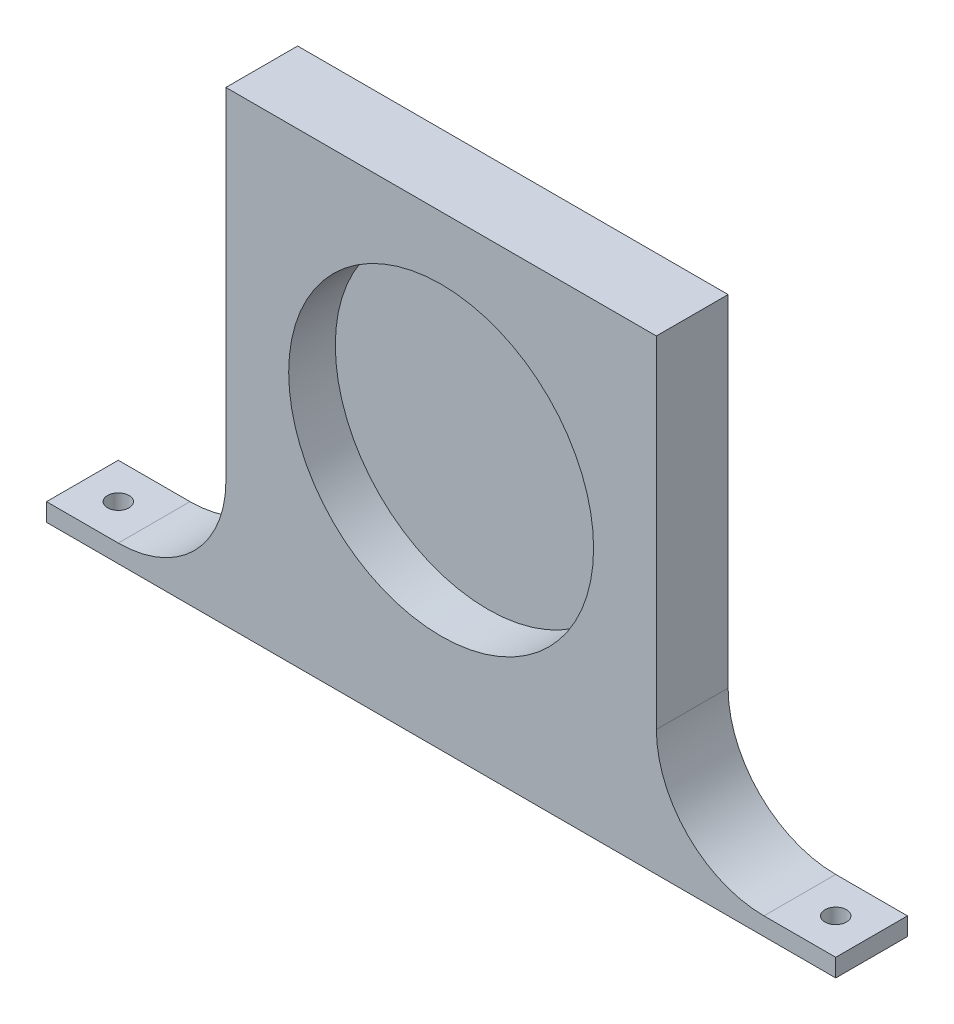
ISO-10303-21;
HEADER;
FILE_DESCRIPTION(('STEP AP214'),'2;1');
FILE_NAME('part.step','',(''),(''),'','','');
FILE_SCHEMA(('AUTOMOTIVE_DESIGN { 1 0 10303 214 1 1 1 1 }'));
ENDSEC;
DATA;
#1=APPLICATION_CONTEXT('core data for automotive mechanical design processes');
#2=APPLICATION_PROTOCOL_DEFINITION('international standard','automotive_design',2000,#1);
#3=PRODUCT_CONTEXT('',#1,'mechanical');
#4=PRODUCT('Part','Part','',(#3));
#5=PRODUCT_RELATED_PRODUCT_CATEGORY('part','',(#4));
#6=PRODUCT_DEFINITION_FORMATION('','',#4);
#7=PRODUCT_DEFINITION_CONTEXT('part definition',#1,'design');
#8=PRODUCT_DEFINITION('design','',#6,#7);
#9=PRODUCT_DEFINITION_SHAPE('','',#8);
#10=(LENGTH_UNIT() NAMED_UNIT(*) SI_UNIT(.MILLI.,.METRE.));
#11=(NAMED_UNIT(*) PLANE_ANGLE_UNIT() SI_UNIT($,.RADIAN.));
#12=(NAMED_UNIT(*) SI_UNIT($,.STERADIAN.) SOLID_ANGLE_UNIT());
#13=UNCERTAINTY_MEASURE_WITH_UNIT(LENGTH_MEASURE(1.E-05),#10,'distance_accuracy_value','');
#14=(GEOMETRIC_REPRESENTATION_CONTEXT(3) GLOBAL_UNCERTAINTY_ASSIGNED_CONTEXT((#13)) GLOBAL_UNIT_ASSIGNED_CONTEXT((#10,
#11,#12)) REPRESENTATION_CONTEXT('',''));
#15=CARTESIAN_POINT('',(0.,0.,0.));
#16=DIRECTION('',(0.,0.,1.));
#17=DIRECTION('',(1.,0.,0.));
#18=AXIS2_PLACEMENT_3D('',#15,#16,#17);
#19=CARTESIAN_POINT('',(-90.,-30.,20.));
#20=DIRECTION('',(0.,0.,-1.));
#21=DIRECTION('',(-1.,0.,0.));
#22=AXIS2_PLACEMENT_3D('',#19,#20,#21);
#23=CYLINDRICAL_SURFACE('',#22,30.);
#24=DIRECTION('',(0.,0.,1.));
#25=VECTOR('',#24,1.);
#26=CARTESIAN_POINT('',(-60.,-30.,20.));
#27=LINE('',#26,#25);
#28=CARTESIAN_POINT('',(-60.,-30.,0.));
#29=VERTEX_POINT('',#28);
#30=CARTESIAN_POINT('',(-60.,-30.,20.));
#31=VERTEX_POINT('',#30);
#32=EDGE_CURVE('E231',#29,#31,#27,.T.);
#33=ORIENTED_EDGE('',*,*,#32,.F.);
#34=CARTESIAN_POINT('',(-90.,-30.,0.));
#35=DIRECTION('',(0.,0.,1.));
#36=DIRECTION('',(1.,0.,0.));
#37=AXIS2_PLACEMENT_3D('',#34,#35,#36);
#38=CIRCLE('',#37,30.);
#39=CARTESIAN_POINT('',(-90.,-60.,0.));
#40=VERTEX_POINT('',#39);
#41=EDGE_CURVE('E51',#29,#40,#38,.F.);
#42=ORIENTED_EDGE('',*,*,#41,.T.);
#43=DIRECTION('',(0.,0.,1.));
#44=VECTOR('',#43,1.);
#45=CARTESIAN_POINT('',(-90.,-60.,20.));
#46=LINE('',#45,#44);
#47=CARTESIAN_POINT('',(-90.,-60.,20.));
#48=VERTEX_POINT('',#47);
#49=EDGE_CURVE('E235',#48,#40,#46,.F.);
#50=ORIENTED_EDGE('',*,*,#49,.F.);
#51=CARTESIAN_POINT('',(-90.,-30.,20.));
#52=DIRECTION('',(0.,0.,1.));
#53=DIRECTION('',(1.,0.,0.));
#54=AXIS2_PLACEMENT_3D('',#51,#52,#53);
#55=CIRCLE('',#54,30.);
#56=EDGE_CURVE('E11',#48,#31,#55,.T.);
#57=ORIENTED_EDGE('',*,*,#56,.T.);
#58=EDGE_LOOP('',(#33,#42,#50,#57));
#59=FACE_BOUND('',#58,.T.);
#60=ADVANCED_FACE('F43',(#59),#23,.F.);
#61=CARTESIAN_POINT('',(-60.,65.,20.));
#62=DIRECTION('',(1.,0.,0.));
#63=DIRECTION('',(0.,1.,0.));
#64=AXIS2_PLACEMENT_3D('',#61,#62,#63);
#65=PLANE('',#64);
#66=DIRECTION('',(0.,-1.,0.));
#67=VECTOR('',#66,1.);
#68=CARTESIAN_POINT('',(-60.,65.,0.));
#69=LINE('',#68,#67);
#70=CARTESIAN_POINT('',(-60.,65.,0.));
#71=VERTEX_POINT('',#70);
#72=EDGE_CURVE('E204',#71,#29,#69,.T.);
#73=ORIENTED_EDGE('',*,*,#72,.T.);
#74=ORIENTED_EDGE('',*,*,#32,.T.);
#75=DIRECTION('',(0.,-1.,0.));
#76=VECTOR('',#75,1.);
#77=CARTESIAN_POINT('',(-60.,65.,20.));
#78=LINE('',#77,#76);
#79=CARTESIAN_POINT('',(-60.,65.,20.));
#80=VERTEX_POINT('',#79);
#81=EDGE_CURVE('E192',#80,#31,#78,.T.);
#82=ORIENTED_EDGE('',*,*,#81,.F.);
#83=DIRECTION('',(0.,0.,-1.));
#84=VECTOR('',#83,1.);
#85=CARTESIAN_POINT('',(-60.,65.,20.));
#86=LINE('',#85,#84);
#87=EDGE_CURVE('E198',#80,#71,#86,.T.);
#88=ORIENTED_EDGE('',*,*,#87,.T.);
#89=EDGE_LOOP('',(#73,#74,#82,#88));
#90=FACE_BOUND('',#89,.T.);
#91=ADVANCED_FACE('F268',(#90),#65,.F.);
#92=CARTESIAN_POINT('',(90.,-30.,20.));
#93=DIRECTION('',(0.,0.,1.));
#94=DIRECTION('',(1.,0.,0.));
#95=AXIS2_PLACEMENT_3D('',#92,#93,#94);
#96=CYLINDRICAL_SURFACE('',#95,30.);
#97=DIRECTION('',(0.,0.,-1.));
#98=VECTOR('',#97,1.);
#99=CARTESIAN_POINT('',(60.,-30.,20.));
#100=LINE('',#99,#98);
#101=CARTESIAN_POINT('',(60.,-30.,20.));
#102=VERTEX_POINT('',#101);
#103=CARTESIAN_POINT('',(60.,-30.,0.));
#104=VERTEX_POINT('',#103);
#105=EDGE_CURVE('E217',#102,#104,#100,.T.);
#106=ORIENTED_EDGE('',*,*,#105,.F.);
#107=CARTESIAN_POINT('',(90.,-30.,20.));
#108=DIRECTION('',(0.,0.,1.));
#109=DIRECTION('',(1.,0.,0.));
#110=AXIS2_PLACEMENT_3D('',#107,#108,#109);
#111=CIRCLE('',#110,30.);
#112=CARTESIAN_POINT('',(90.,-60.,20.));
#113=VERTEX_POINT('',#112);
#114=EDGE_CURVE('E225',#102,#113,#111,.T.);
#115=ORIENTED_EDGE('',*,*,#114,.T.);
#116=DIRECTION('',(0.,0.,-1.));
#117=VECTOR('',#116,1.);
#118=CARTESIAN_POINT('',(90.,-60.,20.));
#119=LINE('',#118,#117);
#120=CARTESIAN_POINT('',(90.,-60.,0.));
#121=VERTEX_POINT('',#120);
#122=EDGE_CURVE('E221',#121,#113,#119,.F.);
#123=ORIENTED_EDGE('',*,*,#122,.F.);
#124=CARTESIAN_POINT('',(90.,-30.,0.));
#125=DIRECTION('',(0.,0.,1.));
#126=DIRECTION('',(1.,0.,0.));
#127=AXIS2_PLACEMENT_3D('',#124,#125,#126);
#128=CIRCLE('',#127,30.);
#129=EDGE_CURVE('E228',#121,#104,#128,.F.);
#130=ORIENTED_EDGE('',*,*,#129,.T.);
#131=EDGE_LOOP('',(#106,#115,#123,#130));
#132=FACE_BOUND('',#131,.T.);
#133=ADVANCED_FACE('F257',(#132),#96,.F.);
#134=CARTESIAN_POINT('',(60.,65.,20.));
#135=DIRECTION('',(-1.,0.,0.));
#136=DIRECTION('',(0.,-1.,0.));
#137=AXIS2_PLACEMENT_3D('',#134,#135,#136);
#138=PLANE('',#137);
#139=DIRECTION('',(0.,1.,0.));
#140=VECTOR('',#139,1.);
#141=CARTESIAN_POINT('',(60.,65.,20.));
#142=LINE('',#141,#140);
#143=CARTESIAN_POINT('',(60.,65.,20.));
#144=VERTEX_POINT('',#143);
#145=EDGE_CURVE('E185',#102,#144,#142,.T.);
#146=ORIENTED_EDGE('',*,*,#145,.F.);
#147=ORIENTED_EDGE('',*,*,#105,.T.);
#148=DIRECTION('',(0.,1.,0.));
#149=VECTOR('',#148,1.);
#150=CARTESIAN_POINT('',(60.,65.,0.));
#151=LINE('',#150,#149);
#152=CARTESIAN_POINT('',(60.,65.,0.));
#153=VERTEX_POINT('',#152);
#154=EDGE_CURVE('E181',#104,#153,#151,.T.);
#155=ORIENTED_EDGE('',*,*,#154,.T.);
#156=DIRECTION('',(0.,0.,-1.));
#157=VECTOR('',#156,1.);
#158=CARTESIAN_POINT('',(60.,65.,20.));
#159=LINE('',#158,#157);
#160=EDGE_CURVE('E213',#144,#153,#159,.T.);
#161=ORIENTED_EDGE('',*,*,#160,.F.);
#162=EDGE_LOOP('',(#146,#147,#155,#161));
#163=FACE_BOUND('',#162,.T.);
#164=ADVANCED_FACE('F261',(#163),#138,.F.);
#165=CARTESIAN_POINT('',(-60.,65.,20.));
#166=DIRECTION('',(0.,-1.,0.));
#167=DIRECTION('',(0.,0.,-1.));
#168=AXIS2_PLACEMENT_3D('',#165,#166,#167);
#169=PLANE('',#168);
#170=DIRECTION('',(-1.,0.,0.));
#171=VECTOR('',#170,1.);
#172=CARTESIAN_POINT('',(-60.,65.,0.));
#173=LINE('',#172,#171);
#174=EDGE_CURVE('E201',#153,#71,#173,.T.);
#175=ORIENTED_EDGE('',*,*,#174,.T.);
#176=ORIENTED_EDGE('',*,*,#87,.F.);
#177=DIRECTION('',(-1.,0.,0.));
#178=VECTOR('',#177,1.);
#179=CARTESIAN_POINT('',(-60.,65.,20.));
#180=LINE('',#179,#178);
#181=EDGE_CURVE('E188',#144,#80,#180,.T.);
#182=ORIENTED_EDGE('',*,*,#181,.F.);
#183=ORIENTED_EDGE('',*,*,#160,.T.);
#184=EDGE_LOOP('',(#175,#176,#182,#183));
#185=FACE_BOUND('',#184,.T.);
#186=ADVANCED_FACE('F264',(#185),#169,.F.);
#187=CARTESIAN_POINT('',(-60.,-65.,20.));
#188=DIRECTION('',(0.,1.,0.));
#189=DIRECTION('',(0.,0.,1.));
#190=AXIS2_PLACEMENT_3D('',#187,#188,#189);
#191=PLANE('',#190);
#192=CARTESIAN_POINT('',(-99.9980418326246,-65.,10.));
#193=DIRECTION('',(0.,-1.,0.));
#194=DIRECTION('',(0.,0.,1.));
#195=AXIS2_PLACEMENT_3D('',#192,#193,#194);
#196=CIRCLE('',#195,3.00000000000001);
#197=CARTESIAN_POINT('',(-99.9980418326246,-65.,13.));
#198=VERTEX_POINT('',#197);
#199=EDGE_CURVE('E459',#198,#198,#196,.T.);
#200=ORIENTED_EDGE('',*,*,#199,.F.);
#201=EDGE_LOOP('',(#200));
#202=FACE_BOUND('',#201,.T.);
#203=CARTESIAN_POINT('',(99.9980418326246,-65.,10.));
#204=DIRECTION('',(0.,1.,0.));
#205=DIRECTION('',(0.,0.,1.));
#206=AXIS2_PLACEMENT_3D('',#203,#204,#205);
#207=CIRCLE('',#206,3.00000000000001);
#208=CARTESIAN_POINT('',(99.9980418326246,-65.,13.));
#209=VERTEX_POINT('',#208);
#210=EDGE_CURVE('E143',#209,#209,#207,.T.);
#211=ORIENTED_EDGE('',*,*,#210,.T.);
#212=EDGE_LOOP('',(#211));
#213=FACE_BOUND('',#212,.T.);
#214=DIRECTION('',(1.,0.,0.));
#215=VECTOR('',#214,1.);
#216=CARTESIAN_POINT('',(-60.,-65.,0.));
#217=LINE('',#216,#215);
#218=CARTESIAN_POINT('',(-110.,-65.,0.));
#219=VERTEX_POINT('',#218);
#220=CARTESIAN_POINT('',(110.,-65.,0.));
#221=VERTEX_POINT('',#220);
#222=EDGE_CURVE('E189',#219,#221,#217,.T.);
#223=ORIENTED_EDGE('',*,*,#222,.T.);
#224=DIRECTION('',(0.,0.,1.));
#225=VECTOR('',#224,1.);
#226=CARTESIAN_POINT('',(110.,-65.,0.));
#227=LINE('',#226,#225);
#228=CARTESIAN_POINT('',(110.,-65.,20.));
#229=VERTEX_POINT('',#228);
#230=EDGE_CURVE('E152',#221,#229,#227,.T.);
#231=ORIENTED_EDGE('',*,*,#230,.T.);
#232=DIRECTION('',(1.,0.,0.));
#233=VECTOR('',#232,1.);
#234=CARTESIAN_POINT('',(-60.,-65.,20.));
#235=LINE('',#234,#233);
#236=CARTESIAN_POINT('',(-110.,-65.,20.));
#237=VERTEX_POINT('',#236);
#238=EDGE_CURVE('E195',#237,#229,#235,.T.);
#239=ORIENTED_EDGE('',*,*,#238,.F.);
#240=DIRECTION('',(0.,0.,1.));
#241=VECTOR('',#240,1.);
#242=CARTESIAN_POINT('',(-110.,-65.,0.));
#243=LINE('',#242,#241);
#244=EDGE_CURVE('E134',#219,#237,#243,.T.);
#245=ORIENTED_EDGE('',*,*,#244,.F.);
#246=EDGE_LOOP('',(#223,#231,#239,#245));
#247=FACE_BOUND('',#246,.T.);
#248=ADVANCED_FACE('F242',(#202,#213,#247),#191,.F.);
#249=CARTESIAN_POINT('',(0.,0.,20.));
#250=DIRECTION('',(0.,0.,1.));
#251=DIRECTION('',(1.,0.,0.));
#252=AXIS2_PLACEMENT_3D('',#249,#250,#251);
#253=PLANE('',#252);
#254=ORIENTED_EDGE('',*,*,#114,.F.);
#255=ORIENTED_EDGE('',*,*,#145,.T.);
#256=ORIENTED_EDGE('',*,*,#181,.T.);
#257=ORIENTED_EDGE('',*,*,#81,.T.);
#258=ORIENTED_EDGE('',*,*,#56,.F.);
#259=DIRECTION('',(1.,0.,0.));
#260=VECTOR('',#259,1.);
#261=CARTESIAN_POINT('',(-60.,-60.,20.));
#262=LINE('',#261,#260);
#263=CARTESIAN_POINT('',(-110.,-60.,20.));
#264=VERTEX_POINT('',#263);
#265=EDGE_CURVE('E121',#264,#48,#262,.T.);
#266=ORIENTED_EDGE('',*,*,#265,.F.);
#267=DIRECTION('',(0.,-1.,0.));
#268=VECTOR('',#267,1.);
#269=CARTESIAN_POINT('',(-110.,-60.,20.));
#270=LINE('',#269,#268);
#271=EDGE_CURVE('E131',#264,#237,#270,.T.);
#272=ORIENTED_EDGE('',*,*,#271,.T.);
#273=ORIENTED_EDGE('',*,*,#238,.T.);
#274=DIRECTION('',(0.,-1.,0.));
#275=VECTOR('',#274,1.);
#276=CARTESIAN_POINT('',(110.,-60.,20.));
#277=LINE('',#276,#275);
#278=CARTESIAN_POINT('',(110.,-60.,20.));
#279=VERTEX_POINT('',#278);
#280=EDGE_CURVE('E169',#279,#229,#277,.T.);
#281=ORIENTED_EDGE('',*,*,#280,.F.);
#282=DIRECTION('',(-1.,0.,0.));
#283=VECTOR('',#282,1.);
#284=CARTESIAN_POINT('',(60.,-60.,20.));
#285=LINE('',#284,#283);
#286=EDGE_CURVE('E161',#279,#113,#285,.T.);
#287=ORIENTED_EDGE('',*,*,#286,.T.);
#288=EDGE_LOOP('',(#254,#255,#256,#257,#258,#266,#272,#273,#281,#287));
#289=FACE_BOUND('',#288,.T.);
#290=CARTESIAN_POINT('',(0.,5.00000000000002,20.));
#291=DIRECTION('',(0.,0.,1.));
#292=DIRECTION('',(1.,0.,0.));
#293=AXIS2_PLACEMENT_3D('',#290,#291,#292);
#294=CIRCLE('',#293,42.5);
#295=CARTESIAN_POINT('',(42.5,5.00000000000002,20.));
#296=VERTEX_POINT('',#295);
#297=EDGE_CURVE('E173',#296,#296,#294,.T.);
#298=ORIENTED_EDGE('',*,*,#297,.F.);
#299=EDGE_LOOP('',(#298));
#300=FACE_BOUND('',#299,.T.);
#301=ADVANCED_FACE('F138',(#289,#300),#253,.T.);
#302=CARTESIAN_POINT('',(0.,0.,0.));
#303=DIRECTION('',(0.,0.,1.));
#304=DIRECTION('',(1.,0.,0.));
#305=AXIS2_PLACEMENT_3D('',#302,#303,#304);
#306=PLANE('',#305);
#307=ORIENTED_EDGE('',*,*,#129,.F.);
#308=DIRECTION('',(1.,0.,0.));
#309=VECTOR('',#308,1.);
#310=CARTESIAN_POINT('',(60.,-60.,0.));
#311=LINE('',#310,#309);
#312=CARTESIAN_POINT('',(110.,-60.,0.));
#313=VERTEX_POINT('',#312);
#314=EDGE_CURVE('E154',#121,#313,#311,.T.);
#315=ORIENTED_EDGE('',*,*,#314,.T.);
#316=DIRECTION('',(0.,-1.,0.));
#317=VECTOR('',#316,1.);
#318=CARTESIAN_POINT('',(110.,-60.,0.));
#319=LINE('',#318,#317);
#320=EDGE_CURVE('E165',#313,#221,#319,.T.);
#321=ORIENTED_EDGE('',*,*,#320,.T.);
#322=ORIENTED_EDGE('',*,*,#222,.F.);
#323=DIRECTION('',(0.,-1.,0.));
#324=VECTOR('',#323,1.);
#325=CARTESIAN_POINT('',(-110.,-60.,0.));
#326=LINE('',#325,#324);
#327=CARTESIAN_POINT('',(-110.,-60.,0.));
#328=VERTEX_POINT('',#327);
#329=EDGE_CURVE('E136',#328,#219,#326,.T.);
#330=ORIENTED_EDGE('',*,*,#329,.F.);
#331=DIRECTION('',(-1.,0.,0.));
#332=VECTOR('',#331,1.);
#333=CARTESIAN_POINT('',(-60.,-60.,0.));
#334=LINE('',#333,#332);
#335=EDGE_CURVE('E123',#40,#328,#334,.T.);
#336=ORIENTED_EDGE('',*,*,#335,.F.);
#337=ORIENTED_EDGE('',*,*,#41,.F.);
#338=ORIENTED_EDGE('',*,*,#72,.F.);
#339=ORIENTED_EDGE('',*,*,#174,.F.);
#340=ORIENTED_EDGE('',*,*,#154,.F.);
#341=EDGE_LOOP('',(#307,#315,#321,#322,#330,#336,#337,#338,#339,#340));
#342=FACE_BOUND('',#341,.T.);
#343=ADVANCED_FACE('F239',(#342),#306,.F.);
#344=CARTESIAN_POINT('',(0.,5.00000000000002,7.));
#345=DIRECTION('',(0.,0.,1.));
#346=DIRECTION('',(1.,0.,0.));
#347=AXIS2_PLACEMENT_3D('',#344,#345,#346);
#348=CYLINDRICAL_SURFACE('',#347,42.5);
#349=CARTESIAN_POINT('',(0.,5.00000000000002,7.));
#350=DIRECTION('',(0.,0.,1.));
#351=DIRECTION('',(1.,0.,0.));
#352=AXIS2_PLACEMENT_3D('',#349,#350,#351);
#353=CIRCLE('',#352,42.5);
#354=CARTESIAN_POINT('',(42.5,5.00000000000002,7.));
#355=VERTEX_POINT('',#354);
#356=EDGE_CURVE('E177',#355,#355,#353,.T.);
#357=CARTESIAN_POINT('',(42.5,5.00000000000002,7.));
#358=CARTESIAN_POINT('',(42.5,5.00000000000002,7.13541666666667));
#359=CARTESIAN_POINT('',(42.5,5.00000000000002,7.27083333333333));
#360=CARTESIAN_POINT('',(42.5,5.00000000000002,7.54166666666667));
#361=CARTESIAN_POINT('',(42.5,5.00000000000002,7.67708333333333));
#362=CARTESIAN_POINT('',(42.5,5.00000000000002,7.94791666666667));
#363=CARTESIAN_POINT('',(42.5,5.00000000000002,8.08333333333333));
#364=CARTESIAN_POINT('',(42.5,5.00000000000002,8.35416666666667));
#365=CARTESIAN_POINT('',(42.5,5.00000000000002,8.48958333333333));
#366=CARTESIAN_POINT('',(42.5,5.00000000000002,8.76041666666667));
#367=CARTESIAN_POINT('',(42.5,5.00000000000002,8.89583333333333));
#368=CARTESIAN_POINT('',(42.5,5.00000000000002,9.16666666666667));
#369=CARTESIAN_POINT('',(42.5,5.00000000000002,9.30208333333333));
#370=CARTESIAN_POINT('',(42.5,5.00000000000002,9.57291666666667));
#371=CARTESIAN_POINT('',(42.5,5.00000000000002,9.70833333333333));
#372=CARTESIAN_POINT('',(42.5,5.00000000000002,9.97916666666667));
#373=CARTESIAN_POINT('',(42.5,5.00000000000002,10.1145833333333));
#374=CARTESIAN_POINT('',(42.5,5.00000000000002,10.3854166666667));
#375=CARTESIAN_POINT('',(42.5,5.00000000000002,10.5208333333333));
#376=CARTESIAN_POINT('',(42.5,5.00000000000002,10.7916666666667));
#377=CARTESIAN_POINT('',(42.5,5.00000000000002,10.9270833333333));
#378=CARTESIAN_POINT('',(42.5,5.00000000000002,11.1979166666667));
#379=CARTESIAN_POINT('',(42.5,5.00000000000002,11.3333333333333));
#380=CARTESIAN_POINT('',(42.5,5.00000000000002,11.6041666666667));
#381=CARTESIAN_POINT('',(42.5,5.00000000000002,11.7395833333333));
#382=CARTESIAN_POINT('',(42.5,5.00000000000002,12.0104166666667));
#383=CARTESIAN_POINT('',(42.5,5.00000000000002,12.1458333333333));
#384=CARTESIAN_POINT('',(42.5,5.00000000000002,12.4166666666667));
#385=CARTESIAN_POINT('',(42.5,5.00000000000002,12.5520833333333));
#386=CARTESIAN_POINT('',(42.5,5.00000000000002,12.8229166666667));
#387=CARTESIAN_POINT('',(42.5,5.00000000000002,12.9583333333333));
#388=CARTESIAN_POINT('',(42.5,5.00000000000002,13.2291666666667));
#389=CARTESIAN_POINT('',(42.5,5.00000000000002,13.3645833333333));
#390=CARTESIAN_POINT('',(42.5,5.00000000000002,13.6354166666667));
#391=CARTESIAN_POINT('',(42.5,5.00000000000002,13.7708333333333));
#392=CARTESIAN_POINT('',(42.5,5.00000000000002,14.0416666666667));
#393=CARTESIAN_POINT('',(42.5,5.00000000000002,14.1770833333333));
#394=CARTESIAN_POINT('',(42.5,5.00000000000002,14.4479166666667));
#395=CARTESIAN_POINT('',(42.5,5.00000000000002,14.5833333333333));
#396=CARTESIAN_POINT('',(42.5,5.00000000000002,14.8541666666667));
#397=CARTESIAN_POINT('',(42.5,5.00000000000002,14.9895833333333));
#398=CARTESIAN_POINT('',(42.5,5.00000000000002,15.2604166666667));
#399=CARTESIAN_POINT('',(42.5,5.00000000000002,15.3958333333333));
#400=CARTESIAN_POINT('',(42.5,5.00000000000002,15.6666666666667));
#401=CARTESIAN_POINT('',(42.5,5.00000000000002,15.8020833333333));
#402=CARTESIAN_POINT('',(42.5,5.00000000000002,16.0729166666667));
#403=CARTESIAN_POINT('',(42.5,5.00000000000002,16.2083333333333));
#404=CARTESIAN_POINT('',(42.5,5.00000000000002,16.4791666666667));
#405=CARTESIAN_POINT('',(42.5,5.00000000000002,16.6145833333333));
#406=CARTESIAN_POINT('',(42.5,5.00000000000002,16.8854166666667));
#407=CARTESIAN_POINT('',(42.5,5.00000000000002,17.0208333333333));
#408=CARTESIAN_POINT('',(42.5,5.00000000000002,17.2916666666667));
#409=CARTESIAN_POINT('',(42.5,5.00000000000002,17.4270833333333));
#410=CARTESIAN_POINT('',(42.5,5.00000000000002,17.6979166666667));
#411=CARTESIAN_POINT('',(42.5,5.00000000000002,17.8333333333333));
#412=CARTESIAN_POINT('',(42.5,5.00000000000002,18.1041666666667));
#413=CARTESIAN_POINT('',(42.5,5.00000000000002,18.2395833333333));
#414=CARTESIAN_POINT('',(42.5,5.00000000000002,18.5104166666667));
#415=CARTESIAN_POINT('',(42.5,5.00000000000002,18.6458333333333));
#416=CARTESIAN_POINT('',(42.5,5.00000000000002,18.9166666666667));
#417=CARTESIAN_POINT('',(42.5,5.00000000000002,19.0520833333333));
#418=CARTESIAN_POINT('',(42.5,5.00000000000002,19.3229166666667));
#419=CARTESIAN_POINT('',(42.5,5.00000000000002,19.4583333333333));
#420=CARTESIAN_POINT('',(42.5,5.00000000000002,19.7291666666667));
#421=CARTESIAN_POINT('',(42.5,5.00000000000002,19.8645833333333));
#422=CARTESIAN_POINT('',(42.5,5.00000000000002,20.));
#423=B_SPLINE_CURVE_WITH_KNOTS('',3,(#357,#358,#359,#360,#361,#362,#363,#364,#365,#366,#367,
#368,#369,#370,#371,#372,#373,#374,#375,#376,#377,#378,#379,#380,#381,#382,#383,#384,#385,#386,
#387,#388,#389,#390,#391,#392,#393,#394,#395,#396,#397,#398,#399,#400,#401,#402,#403,#404,#405,
#406,#407,#408,#409,#410,#411,#412,#413,#414,#415,#416,#417,#418,#419,#420,#421,#422),
.UNSPECIFIED.,.F.,.F.,(4,2,2,2,2,2,2,2,2,2,2,2,2,2,2,2,2,2,2,2,2,2,2,2,2,2,2,2,2,2,2,2,4),(0.,
0.40625,0.8125,1.21875,1.625,2.03125,2.4375,2.84375,3.25,3.65625,4.0625,4.46875,4.875,5.28125,
5.6875,6.09375,6.5,6.90625,7.3125,7.71875,8.125,8.53125,8.9375,9.34375,9.75,10.15625,10.5625,
10.96875,11.375,11.78125,12.1875,12.59375,13.),.UNSPECIFIED.);
#424=EDGE_CURVE('BSEAM313',#355,#296,#423,.T.);
#425=ORIENTED_EDGE('',*,*,#356,.F.);
#426=ORIENTED_EDGE('',*,*,#297,.T.);
#427=ORIENTED_EDGE('',*,*,#424,.T.);
#428=ORIENTED_EDGE('',*,*,#424,.F.);
#429=EDGE_LOOP('',(#425,#427,#426,#428));
#430=FACE_BOUND('',#429,.T.);
#431=ADVANCED_FACE('F313',(#430),#348,.F.);
#432=CARTESIAN_POINT('',(0.,5.00000000000002,7.));
#433=DIRECTION('',(0.,0.,1.));
#434=DIRECTION('',(1.,0.,0.));
#435=AXIS2_PLACEMENT_3D('',#432,#433,#434);
#436=PLANE('',#435);
#437=ORIENTED_EDGE('',*,*,#356,.T.);
#438=EDGE_LOOP('',(#437));
#439=FACE_BOUND('',#438,.T.);
#440=ADVANCED_FACE('F319',(#439),#436,.T.);
#441=CARTESIAN_POINT('',(110.,-60.,0.));
#442=DIRECTION('',(1.,0.,0.));
#443=DIRECTION('',(0.,0.,-1.));
#444=AXIS2_PLACEMENT_3D('',#441,#442,#443);
#445=PLANE('',#444);
#446=ORIENTED_EDGE('',*,*,#230,.F.);
#447=ORIENTED_EDGE('',*,*,#320,.F.);
#448=DIRECTION('',(0.,0.,1.));
#449=VECTOR('',#448,1.);
#450=CARTESIAN_POINT('',(110.,-60.,0.));
#451=LINE('',#450,#449);
#452=EDGE_CURVE('E157',#313,#279,#451,.T.);
#453=ORIENTED_EDGE('',*,*,#452,.T.);
#454=ORIENTED_EDGE('',*,*,#280,.T.);
#455=EDGE_LOOP('',(#446,#447,#453,#454));
#456=FACE_BOUND('',#455,.T.);
#457=ADVANCED_FACE('F245',(#456),#445,.T.);
#458=CARTESIAN_POINT('',(0.,-60.,0.));
#459=DIRECTION('',(0.,-1.,0.));
#460=DIRECTION('',(0.,0.,-1.));
#461=AXIS2_PLACEMENT_3D('',#458,#459,#460);
#462=PLANE('',#461);
#463=CARTESIAN_POINT('',(99.9980418326246,-60.,10.));
#464=DIRECTION('',(0.,1.,0.));
#465=DIRECTION('',(0.,0.,1.));
#466=AXIS2_PLACEMENT_3D('',#463,#464,#465);
#467=CIRCLE('',#466,3.00000000000001);
#468=CARTESIAN_POINT('',(99.9980418326246,-60.,13.));
#469=VERTEX_POINT('',#468);
#470=EDGE_CURVE('E146',#469,#469,#467,.T.);
#471=ORIENTED_EDGE('',*,*,#470,.F.);
#472=EDGE_LOOP('',(#471));
#473=FACE_BOUND('',#472,.T.);
#474=ORIENTED_EDGE('',*,*,#314,.F.);
#475=ORIENTED_EDGE('',*,*,#122,.T.);
#476=ORIENTED_EDGE('',*,*,#286,.F.);
#477=ORIENTED_EDGE('',*,*,#452,.F.);
#478=EDGE_LOOP('',(#474,#475,#476,#477));
#479=FACE_BOUND('',#478,.T.);
#480=ADVANCED_FACE('F251',(#473,#479),#462,.F.);
#481=CARTESIAN_POINT('',(-110.,-60.,0.));
#482=DIRECTION('',(1.,0.,0.));
#483=DIRECTION('',(0.,0.,-1.));
#484=AXIS2_PLACEMENT_3D('',#481,#482,#483);
#485=PLANE('',#484);
#486=ORIENTED_EDGE('',*,*,#244,.T.);
#487=ORIENTED_EDGE('',*,*,#271,.F.);
#488=DIRECTION('',(0.,0.,1.));
#489=VECTOR('',#488,1.);
#490=CARTESIAN_POINT('',(-110.,-60.,0.));
#491=LINE('',#490,#489);
#492=EDGE_CURVE('E118',#328,#264,#491,.T.);
#493=ORIENTED_EDGE('',*,*,#492,.F.);
#494=ORIENTED_EDGE('',*,*,#329,.T.);
#495=EDGE_LOOP('',(#486,#487,#493,#494));
#496=FACE_BOUND('',#495,.T.);
#497=ADVANCED_FACE('F132',(#496),#485,.F.);
#498=CARTESIAN_POINT('',(0.,-60.,0.));
#499=DIRECTION('',(0.,-1.,0.));
#500=DIRECTION('',(0.,0.,-1.));
#501=AXIS2_PLACEMENT_3D('',#498,#499,#500);
#502=PLANE('',#501);
#503=CARTESIAN_POINT('',(-99.9980418326246,-60.,10.));
#504=DIRECTION('',(0.,-1.,0.));
#505=DIRECTION('',(0.,0.,1.));
#506=AXIS2_PLACEMENT_3D('',#503,#504,#505);
#507=CIRCLE('',#506,3.00000000000001);
#508=CARTESIAN_POINT('',(-99.9980418326246,-60.,13.));
#509=VERTEX_POINT('',#508);
#510=EDGE_CURVE('E462',#509,#509,#507,.T.);
#511=ORIENTED_EDGE('',*,*,#510,.T.);
#512=EDGE_LOOP('',(#511));
#513=FACE_BOUND('',#512,.T.);
#514=ORIENTED_EDGE('',*,*,#265,.T.);
#515=ORIENTED_EDGE('',*,*,#49,.T.);
#516=ORIENTED_EDGE('',*,*,#335,.T.);
#517=ORIENTED_EDGE('',*,*,#492,.T.);
#518=EDGE_LOOP('',(#514,#515,#516,#517));
#519=FACE_BOUND('',#518,.T.);
#520=ADVANCED_FACE('F120',(#513,#519),#502,.F.);
#521=CARTESIAN_POINT('',(99.9980418326246,-65.,10.));
#522=DIRECTION('',(0.,1.,0.));
#523=DIRECTION('',(0.,0.,1.));
#524=AXIS2_PLACEMENT_3D('',#521,#522,#523);
#525=CYLINDRICAL_SURFACE('',#524,3.00000000000001);
#526=ORIENTED_EDGE('',*,*,#210,.F.);
#527=EDGE_LOOP('',(#526));
#528=FACE_BOUND('',#527,.T.);
#529=ORIENTED_EDGE('',*,*,#470,.T.);
#530=EDGE_LOOP('',(#529));
#531=FACE_BOUND('',#530,.T.);
#532=ADVANCED_FACE('F350',(#528,#531),#525,.F.);
#533=CARTESIAN_POINT('',(-99.9980418326246,-65.,10.));
#534=DIRECTION('',(0.,1.,0.));
#535=DIRECTION('',(0.,0.,1.));
#536=AXIS2_PLACEMENT_3D('',#533,#534,#535);
#537=CYLINDRICAL_SURFACE('',#536,3.00000000000001);
#538=ORIENTED_EDGE('',*,*,#199,.T.);
#539=EDGE_LOOP('',(#538));
#540=FACE_BOUND('',#539,.T.);
#541=ORIENTED_EDGE('',*,*,#510,.F.);
#542=EDGE_LOOP('',(#541));
#543=FACE_BOUND('',#542,.T.);
#544=ADVANCED_FACE('F358',(#540,#543),#537,.F.);
#545=CLOSED_SHELL('',(#60,#91,#133,#164,#186,#248,#301,#343,#431,#440,#457,#480,#497,#520,#532,#544));
#546=MANIFOLD_SOLID_BREP('B2',#545);
#547=ADVANCED_BREP_SHAPE_REPRESENTATION('',(#18,#546),#14);
#548=SHAPE_DEFINITION_REPRESENTATION(#9,#547);
ENDSEC;
END-ISO-10303-21;
